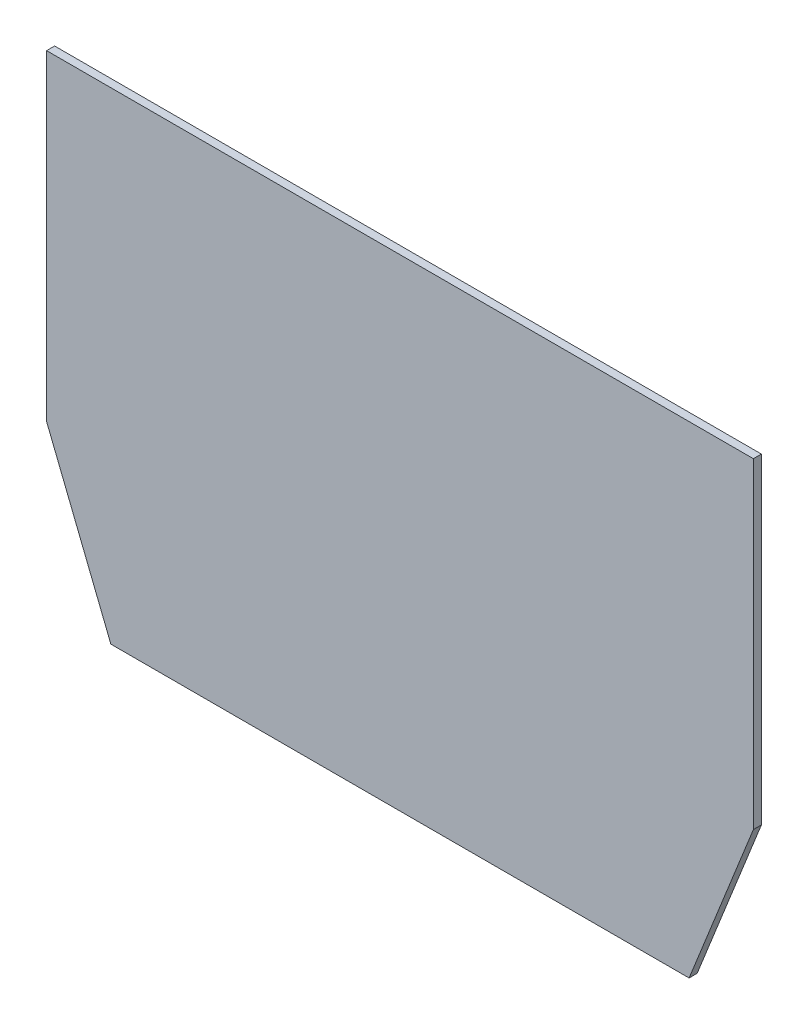
ISO-10303-21;
HEADER;
FILE_DESCRIPTION(('STEP AP214'),'2;1');
FILE_NAME('part.step','',(''),(''),'','','');
FILE_SCHEMA(('AUTOMOTIVE_DESIGN { 1 0 10303 214 1 1 1 1 }'));
ENDSEC;
DATA;
#1=APPLICATION_CONTEXT('core data for automotive mechanical design processes');
#2=APPLICATION_PROTOCOL_DEFINITION('international standard','automotive_design',2000,#1);
#3=PRODUCT_CONTEXT('',#1,'mechanical');
#4=PRODUCT('Part','Part','',(#3));
#5=PRODUCT_RELATED_PRODUCT_CATEGORY('part','',(#4));
#6=PRODUCT_DEFINITION_FORMATION('','',#4);
#7=PRODUCT_DEFINITION_CONTEXT('part definition',#1,'design');
#8=PRODUCT_DEFINITION('design','',#6,#7);
#9=PRODUCT_DEFINITION_SHAPE('','',#8);
#10=(LENGTH_UNIT() NAMED_UNIT(*) SI_UNIT(.MILLI.,.METRE.));
#11=(NAMED_UNIT(*) PLANE_ANGLE_UNIT() SI_UNIT($,.RADIAN.));
#12=(NAMED_UNIT(*) SI_UNIT($,.STERADIAN.) SOLID_ANGLE_UNIT());
#13=UNCERTAINTY_MEASURE_WITH_UNIT(LENGTH_MEASURE(1.E-05),#10,'distance_accuracy_value','');
#14=(GEOMETRIC_REPRESENTATION_CONTEXT(3) GLOBAL_UNCERTAINTY_ASSIGNED_CONTEXT((#13)) GLOBAL_UNIT_ASSIGNED_CONTEXT((#10,
#11,#12)) REPRESENTATION_CONTEXT('',''));
#15=CARTESIAN_POINT('',(0.,0.,0.));
#16=DIRECTION('',(0.,0.,1.));
#17=DIRECTION('',(1.,0.,0.));
#18=AXIS2_PLACEMENT_3D('',#15,#16,#17);
#19=CARTESIAN_POINT('',(0.,63.5,3.175));
#20=DIRECTION('',(0.928476690885259,0.371390676354104,0.));
#21=DIRECTION('',(-0.371390676354104,0.928476690885259,0.));
#22=AXIS2_PLACEMENT_3D('',#19,#20,#21);
#23=PLANE('',#22);
#24=DIRECTION('',(0.371390676354104,-0.928476690885259,0.));
#25=VECTOR('',#24,1.);
#26=CARTESIAN_POINT('',(0.,63.5,0.));
#27=LINE('',#26,#25);
#28=CARTESIAN_POINT('',(0.,63.5,0.));
#29=VERTEX_POINT('',#28);
#30=CARTESIAN_POINT('',(25.4,0.,0.));
#31=VERTEX_POINT('',#30);
#32=EDGE_CURVE('E128',#29,#31,#27,.T.);
#33=ORIENTED_EDGE('',*,*,#32,.T.);
#34=DIRECTION('',(0.,0.,-1.));
#35=VECTOR('',#34,1.);
#36=CARTESIAN_POINT('',(25.4,0.,3.175));
#37=LINE('',#36,#35);
#38=CARTESIAN_POINT('',(25.4,0.,3.175));
#39=VERTEX_POINT('',#38);
#40=EDGE_CURVE('E11',#39,#31,#37,.T.);
#41=ORIENTED_EDGE('',*,*,#40,.F.);
#42=DIRECTION('',(0.371390676354104,-0.928476690885259,0.));
#43=VECTOR('',#42,1.);
#44=CARTESIAN_POINT('',(0.,63.5,3.175));
#45=LINE('',#44,#43);
#46=CARTESIAN_POINT('',(0.,63.5,3.175));
#47=VERTEX_POINT('',#46);
#48=EDGE_CURVE('E144',#47,#39,#45,.T.);
#49=ORIENTED_EDGE('',*,*,#48,.F.);
#50=DIRECTION('',(0.,0.,-1.));
#51=VECTOR('',#50,1.);
#52=CARTESIAN_POINT('',(0.,63.5,3.175));
#53=LINE('',#52,#51);
#54=EDGE_CURVE('E124',#47,#29,#53,.T.);
#55=ORIENTED_EDGE('',*,*,#54,.T.);
#56=EDGE_LOOP('',(#33,#41,#49,#55));
#57=FACE_BOUND('',#56,.T.);
#58=ADVANCED_FACE('F39',(#57),#23,.F.);
#59=CARTESIAN_POINT('',(25.4,0.,3.175));
#60=DIRECTION('',(0.,1.,0.));
#61=DIRECTION('',(0.,0.,1.));
#62=AXIS2_PLACEMENT_3D('',#59,#60,#61);
#63=PLANE('',#62);
#64=DIRECTION('',(1.,0.,0.));
#65=VECTOR('',#64,1.);
#66=CARTESIAN_POINT('',(25.4,0.,0.));
#67=LINE('',#66,#65);
#68=CARTESIAN_POINT('',(254.,0.,0.));
#69=VERTEX_POINT('',#68);
#70=EDGE_CURVE('E132',#31,#69,#67,.T.);
#71=ORIENTED_EDGE('',*,*,#70,.T.);
#72=DIRECTION('',(0.,0.,-1.));
#73=VECTOR('',#72,1.);
#74=CARTESIAN_POINT('',(254.,0.,3.175));
#75=LINE('',#74,#73);
#76=CARTESIAN_POINT('',(254.,0.,3.175));
#77=VERTEX_POINT('',#76);
#78=EDGE_CURVE('E48',#77,#69,#75,.T.);
#79=ORIENTED_EDGE('',*,*,#78,.F.);
#80=DIRECTION('',(1.,0.,0.));
#81=VECTOR('',#80,1.);
#82=CARTESIAN_POINT('',(25.4,0.,3.175));
#83=LINE('',#82,#81);
#84=EDGE_CURVE('E93',#39,#77,#83,.T.);
#85=ORIENTED_EDGE('',*,*,#84,.F.);
#86=ORIENTED_EDGE('',*,*,#40,.T.);
#87=EDGE_LOOP('',(#71,#79,#85,#86));
#88=FACE_BOUND('',#87,.T.);
#89=ADVANCED_FACE('F172',(#88),#63,.F.);
#90=CARTESIAN_POINT('',(254.,0.,3.175));
#91=DIRECTION('',(-0.928476690885259,0.371390676354103,0.));
#92=DIRECTION('',(-0.371390676354103,-0.92847669088526,0.));
#93=AXIS2_PLACEMENT_3D('',#90,#91,#92);
#94=PLANE('',#93);
#95=DIRECTION('',(0.371390676354103,0.928476690885259,0.));
#96=VECTOR('',#95,1.);
#97=CARTESIAN_POINT('',(254.,0.,0.));
#98=LINE('',#97,#96);
#99=CARTESIAN_POINT('',(279.4,63.5,0.));
#100=VERTEX_POINT('',#99);
#101=EDGE_CURVE('E135',#69,#100,#98,.T.);
#102=ORIENTED_EDGE('',*,*,#101,.T.);
#103=DIRECTION('',(0.,0.,-1.));
#104=VECTOR('',#103,1.);
#105=CARTESIAN_POINT('',(279.4,63.5,3.175));
#106=LINE('',#105,#104);
#107=CARTESIAN_POINT('',(279.4,63.5,3.175));
#108=VERTEX_POINT('',#107);
#109=EDGE_CURVE('E117',#108,#100,#106,.T.);
#110=ORIENTED_EDGE('',*,*,#109,.F.);
#111=DIRECTION('',(0.371390676354103,0.928476690885259,0.));
#112=VECTOR('',#111,1.);
#113=CARTESIAN_POINT('',(254.,0.,3.175));
#114=LINE('',#113,#112);
#115=EDGE_CURVE('E106',#77,#108,#114,.T.);
#116=ORIENTED_EDGE('',*,*,#115,.F.);
#117=ORIENTED_EDGE('',*,*,#78,.T.);
#118=EDGE_LOOP('',(#102,#110,#116,#117));
#119=FACE_BOUND('',#118,.T.);
#120=ADVANCED_FACE('F154',(#119),#94,.F.);
#121=CARTESIAN_POINT('',(279.4,63.5,3.175));
#122=DIRECTION('',(-1.,0.,0.));
#123=DIRECTION('',(0.,0.,1.));
#124=AXIS2_PLACEMENT_3D('',#121,#122,#123);
#125=PLANE('',#124);
#126=DIRECTION('',(0.,1.,0.));
#127=VECTOR('',#126,1.);
#128=CARTESIAN_POINT('',(279.4,63.5,0.));
#129=LINE('',#128,#127);
#130=CARTESIAN_POINT('',(279.4,190.5,0.));
#131=VERTEX_POINT('',#130);
#132=EDGE_CURVE('E115',#100,#131,#129,.T.);
#133=ORIENTED_EDGE('',*,*,#132,.T.);
#134=DIRECTION('',(0.,0.,-1.));
#135=VECTOR('',#134,1.);
#136=CARTESIAN_POINT('',(279.4,190.5,3.175));
#137=LINE('',#136,#135);
#138=CARTESIAN_POINT('',(279.4,190.5,3.175));
#139=VERTEX_POINT('',#138);
#140=EDGE_CURVE('E112',#139,#131,#137,.T.);
#141=ORIENTED_EDGE('',*,*,#140,.F.);
#142=DIRECTION('',(0.,1.,0.));
#143=VECTOR('',#142,1.);
#144=CARTESIAN_POINT('',(279.4,63.5,3.175));
#145=LINE('',#144,#143);
#146=EDGE_CURVE('E100',#108,#139,#145,.T.);
#147=ORIENTED_EDGE('',*,*,#146,.F.);
#148=ORIENTED_EDGE('',*,*,#109,.T.);
#149=EDGE_LOOP('',(#133,#141,#147,#148));
#150=FACE_BOUND('',#149,.T.);
#151=ADVANCED_FACE('F113',(#150),#125,.F.);
#152=CARTESIAN_POINT('',(279.4,190.5,3.175));
#153=DIRECTION('',(0.,-1.,0.));
#154=DIRECTION('',(1.,0.,0.));
#155=AXIS2_PLACEMENT_3D('',#152,#153,#154);
#156=PLANE('',#155);
#157=DIRECTION('',(-1.,0.,0.));
#158=VECTOR('',#157,1.);
#159=CARTESIAN_POINT('',(279.4,190.5,0.));
#160=LINE('',#159,#158);
#161=CARTESIAN_POINT('',(0.,190.5,0.));
#162=VERTEX_POINT('',#161);
#163=EDGE_CURVE('E79',#131,#162,#160,.T.);
#164=ORIENTED_EDGE('',*,*,#163,.T.);
#165=DIRECTION('',(0.,0.,-1.));
#166=VECTOR('',#165,1.);
#167=CARTESIAN_POINT('',(0.,190.5,3.175));
#168=LINE('',#167,#166);
#169=CARTESIAN_POINT('',(0.,190.5,3.175));
#170=VERTEX_POINT('',#169);
#171=EDGE_CURVE('E118',#170,#162,#168,.T.);
#172=ORIENTED_EDGE('',*,*,#171,.F.);
#173=DIRECTION('',(-1.,0.,0.));
#174=VECTOR('',#173,1.);
#175=CARTESIAN_POINT('',(279.4,190.5,3.175));
#176=LINE('',#175,#174);
#177=EDGE_CURVE('E104',#139,#170,#176,.T.);
#178=ORIENTED_EDGE('',*,*,#177,.F.);
#179=ORIENTED_EDGE('',*,*,#140,.T.);
#180=EDGE_LOOP('',(#164,#172,#178,#179));
#181=FACE_BOUND('',#180,.T.);
#182=ADVANCED_FACE('F120',(#181),#156,.F.);
#183=CARTESIAN_POINT('',(0.,190.5,3.175));
#184=DIRECTION('',(1.,0.,0.));
#185=DIRECTION('',(0.,1.,0.));
#186=AXIS2_PLACEMENT_3D('',#183,#184,#185);
#187=PLANE('',#186);
#188=DIRECTION('',(0.,-1.,0.));
#189=VECTOR('',#188,1.);
#190=CARTESIAN_POINT('',(0.,190.5,0.));
#191=LINE('',#190,#189);
#192=EDGE_CURVE('E85',#162,#29,#191,.T.);
#193=ORIENTED_EDGE('',*,*,#192,.T.);
#194=ORIENTED_EDGE('',*,*,#54,.F.);
#195=DIRECTION('',(0.,-1.,0.));
#196=VECTOR('',#195,1.);
#197=CARTESIAN_POINT('',(0.,190.5,3.175));
#198=LINE('',#197,#196);
#199=EDGE_CURVE('E56',#170,#47,#198,.T.);
#200=ORIENTED_EDGE('',*,*,#199,.F.);
#201=ORIENTED_EDGE('',*,*,#171,.T.);
#202=EDGE_LOOP('',(#193,#194,#200,#201));
#203=FACE_BOUND('',#202,.T.);
#204=ADVANCED_FACE('F161',(#203),#187,.F.);
#205=CARTESIAN_POINT('',(0.,0.,3.175));
#206=DIRECTION('',(0.,0.,1.));
#207=DIRECTION('',(1.,0.,0.));
#208=AXIS2_PLACEMENT_3D('',#205,#206,#207);
#209=PLANE('',#208);
#210=ORIENTED_EDGE('',*,*,#48,.T.);
#211=ORIENTED_EDGE('',*,*,#84,.T.);
#212=ORIENTED_EDGE('',*,*,#115,.T.);
#213=ORIENTED_EDGE('',*,*,#146,.T.);
#214=ORIENTED_EDGE('',*,*,#177,.T.);
#215=ORIENTED_EDGE('',*,*,#199,.T.);
#216=EDGE_LOOP('',(#210,#211,#212,#213,#214,#215));
#217=FACE_BOUND('',#216,.T.);
#218=ADVANCED_FACE('F102',(#217),#209,.T.);
#219=CARTESIAN_POINT('',(0.,0.,0.));
#220=DIRECTION('',(0.,0.,1.));
#221=DIRECTION('',(1.,0.,0.));
#222=AXIS2_PLACEMENT_3D('',#219,#220,#221);
#223=PLANE('',#222);
#224=ORIENTED_EDGE('',*,*,#32,.F.);
#225=ORIENTED_EDGE('',*,*,#192,.F.);
#226=ORIENTED_EDGE('',*,*,#163,.F.);
#227=ORIENTED_EDGE('',*,*,#132,.F.);
#228=ORIENTED_EDGE('',*,*,#101,.F.);
#229=ORIENTED_EDGE('',*,*,#70,.F.);
#230=EDGE_LOOP('',(#224,#225,#226,#227,#228,#229));
#231=FACE_BOUND('',#230,.T.);
#232=ADVANCED_FACE('F157',(#231),#223,.F.);
#233=CLOSED_SHELL('',(#58,#89,#120,#151,#182,#204,#218,#232));
#234=MANIFOLD_SOLID_BREP('B2',#233);
#235=ADVANCED_BREP_SHAPE_REPRESENTATION('',(#18,#234),#14);
#236=SHAPE_DEFINITION_REPRESENTATION(#9,#235);
ENDSEC;
END-ISO-10303-21;
